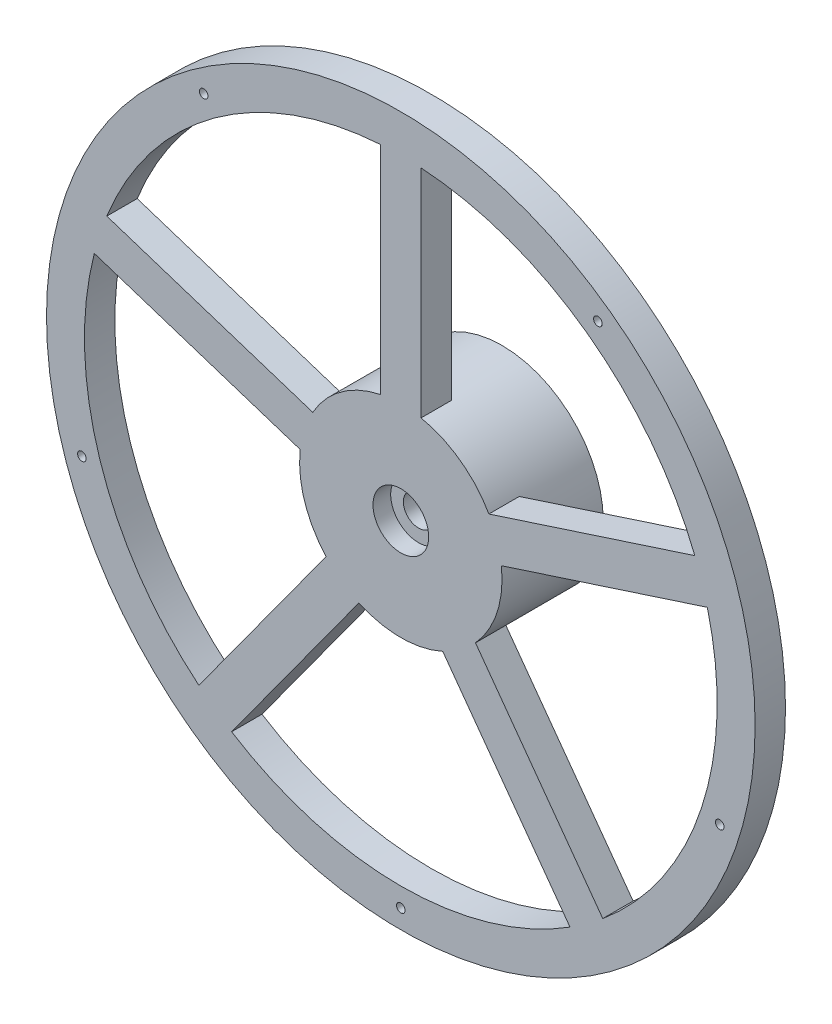
ISO-10303-21;
HEADER;
FILE_DESCRIPTION(('STEP AP214'),'2;1');
FILE_NAME('part.step','',(''),(''),'','','');
FILE_SCHEMA(('AUTOMOTIVE_DESIGN { 1 0 10303 214 1 1 1 1 }'));
ENDSEC;
DATA;
#1=APPLICATION_CONTEXT('core data for automotive mechanical design processes');
#2=APPLICATION_PROTOCOL_DEFINITION('international standard','automotive_design',2000,#1);
#3=PRODUCT_CONTEXT('',#1,'mechanical');
#4=PRODUCT('Part','Part','',(#3));
#5=PRODUCT_RELATED_PRODUCT_CATEGORY('part','',(#4));
#6=PRODUCT_DEFINITION_FORMATION('','',#4);
#7=PRODUCT_DEFINITION_CONTEXT('part definition',#1,'design');
#8=PRODUCT_DEFINITION('design','',#6,#7);
#9=PRODUCT_DEFINITION_SHAPE('','',#8);
#10=(LENGTH_UNIT() NAMED_UNIT(*) SI_UNIT(.MILLI.,.METRE.));
#11=(NAMED_UNIT(*) PLANE_ANGLE_UNIT() SI_UNIT($,.RADIAN.));
#12=(NAMED_UNIT(*) SI_UNIT($,.STERADIAN.) SOLID_ANGLE_UNIT());
#13=UNCERTAINTY_MEASURE_WITH_UNIT(LENGTH_MEASURE(1.E-05),#10,'distance_accuracy_value','');
#14=(GEOMETRIC_REPRESENTATION_CONTEXT(3) GLOBAL_UNCERTAINTY_ASSIGNED_CONTEXT((#13)) GLOBAL_UNIT_ASSIGNED_CONTEXT((#10,
#11,#12)) REPRESENTATION_CONTEXT('',''));
#15=CARTESIAN_POINT('',(0.,0.,0.));
#16=DIRECTION('',(0.,0.,1.));
#17=DIRECTION('',(1.,0.,0.));
#18=AXIS2_PLACEMENT_3D('',#15,#16,#17);
#19=CARTESIAN_POINT('',(0.,0.,40.));
#20=DIRECTION('',(0.,0.,-1.));
#21=DIRECTION('',(-1.,0.,0.));
#22=AXIS2_PLACEMENT_3D('',#19,#20,#21);
#23=CYLINDRICAL_SURFACE('',#22,6.);
#24=CARTESIAN_POINT('',(0.,0.,7.));
#25=DIRECTION('',(0.,0.,1.));
#26=DIRECTION('',(1.,0.,0.));
#27=AXIS2_PLACEMENT_3D('',#24,#25,#26);
#28=CIRCLE('',#27,6.);
#29=CARTESIAN_POINT('',(6.,0.,7.));
#30=VERTEX_POINT('',#29);
#31=EDGE_CURVE('E200',#30,#30,#28,.T.);
#32=ORIENTED_EDGE('',*,*,#31,.F.);
#33=EDGE_LOOP('',(#32));
#34=FACE_BOUND('',#33,.T.);
#35=CARTESIAN_POINT('',(0.,0.,33.));
#36=DIRECTION('',(0.,0.,1.));
#37=DIRECTION('',(1.,0.,0.));
#38=AXIS2_PLACEMENT_3D('',#35,#36,#37);
#39=CIRCLE('',#38,6.);
#40=CARTESIAN_POINT('',(6.,0.,33.));
#41=VERTEX_POINT('',#40);
#42=EDGE_CURVE('E43',#41,#41,#39,.T.);
#43=ORIENTED_EDGE('',*,*,#42,.T.);
#44=EDGE_LOOP('',(#43));
#45=FACE_BOUND('',#44,.T.);
#46=ADVANCED_FACE('F39',(#34,#45),#23,.F.);
#47=CARTESIAN_POINT('',(0.,0.,40.));
#48=DIRECTION('',(0.,0.,-1.));
#49=DIRECTION('',(-1.,0.,0.));
#50=AXIS2_PLACEMENT_3D('',#47,#48,#49);
#51=CYLINDRICAL_SURFACE('',#50,125.);
#52=CARTESIAN_POINT('',(0.,0.,40.));
#53=DIRECTION('',(0.,0.,1.));
#54=DIRECTION('',(1.,0.,0.));
#55=AXIS2_PLACEMENT_3D('',#52,#53,#54);
#56=CIRCLE('',#55,125.);
#57=CARTESIAN_POINT('',(-66.8503931562206,-105.622085450244,40.));
#58=VERTEX_POINT('',#57);
#59=CARTESIAN_POINT('',(66.8503931562205,-105.622085450244,40.));
#60=VERTEX_POINT('',#59);
#61=EDGE_CURVE('E862',#58,#60,#56,.T.);
#62=ORIENTED_EDGE('',*,*,#61,.T.);
#63=DIRECTION('',(0.,0.,-1.));
#64=VECTOR('',#63,1.);
#65=CARTESIAN_POINT('',(66.8503931562205,-105.622085450244,40.));
#66=LINE('',#65,#64);
#67=CARTESIAN_POINT('',(66.8503931562205,-105.622085450244,28.));
#68=VERTEX_POINT('',#67);
#69=EDGE_CURVE('E205',#60,#68,#66,.T.);
#70=ORIENTED_EDGE('',*,*,#69,.T.);
#71=CARTESIAN_POINT('',(0.,0.,28.));
#72=DIRECTION('',(0.,0.,1.));
#73=DIRECTION('',(1.,0.,0.));
#74=AXIS2_PLACEMENT_3D('',#71,#72,#73);
#75=CIRCLE('',#74,125.);
#76=CARTESIAN_POINT('',(-66.8503931562206,-105.622085450244,28.));
#77=VERTEX_POINT('',#76);
#78=EDGE_CURVE('E871',#77,#68,#75,.T.);
#79=ORIENTED_EDGE('',*,*,#78,.F.);
#80=DIRECTION('',(0.,0.,-1.));
#81=VECTOR('',#80,1.);
#82=CARTESIAN_POINT('',(-66.8503931562205,-105.622085450244,40.));
#83=LINE('',#82,#81);
#84=EDGE_CURVE('E222',#77,#58,#83,.F.);
#85=ORIENTED_EDGE('',*,*,#84,.T.);
#86=EDGE_LOOP('',(#62,#70,#79,#85));
#87=FACE_BOUND('',#86,.T.);
#88=ADVANCED_FACE('F421',(#87),#51,.F.);
#89=CARTESIAN_POINT('',(79.7946650662197,-96.2175214135649,28.));
#90=VERTEX_POINT('',#89);
#91=CARTESIAN_POINT('',(121.110480198057,30.9394826426681,28.));
#92=VERTEX_POINT('',#91);
#93=EDGE_CURVE('E290',#90,#92,#75,.T.);
#94=ORIENTED_EDGE('',*,*,#93,.F.);
#95=DIRECTION('',(0.,0.,-1.));
#96=VECTOR('',#95,1.);
#97=CARTESIAN_POINT('',(79.7946650662197,-96.2175214135649,40.));
#98=LINE('',#97,#96);
#99=CARTESIAN_POINT('',(79.7946650662197,-96.2175214135649,40.));
#100=VERTEX_POINT('',#99);
#101=EDGE_CURVE('E177',#90,#100,#98,.F.);
#102=ORIENTED_EDGE('',*,*,#101,.T.);
#103=CARTESIAN_POINT('',(121.110480198057,30.9394826426681,40.));
#104=VERTEX_POINT('',#103);
#105=EDGE_CURVE('E300',#100,#104,#56,.T.);
#106=ORIENTED_EDGE('',*,*,#105,.T.);
#107=DIRECTION('',(0.,0.,-1.));
#108=VECTOR('',#107,1.);
#109=CARTESIAN_POINT('',(121.110480198057,30.9394826426681,40.));
#110=LINE('',#109,#108);
#111=EDGE_CURVE('E313',#104,#92,#110,.T.);
#112=ORIENTED_EDGE('',*,*,#111,.T.);
#113=EDGE_LOOP('',(#94,#102,#106,#112));
#114=FACE_BOUND('',#113,.T.);
#115=ADVANCED_FACE('F429',(#114),#51,.F.);
#116=CARTESIAN_POINT('',(0.,0.,40.));
#117=DIRECTION('',(0.,0.,-1.));
#118=DIRECTION('',(-1.,0.,0.));
#119=AXIS2_PLACEMENT_3D('',#116,#117,#118);
#120=CYLINDRICAL_SURFACE('',#119,40.);
#121=CARTESIAN_POINT('',(0.,0.,0.));
#122=DIRECTION('',(0.,0.,1.));
#123=DIRECTION('',(1.,0.,0.));
#124=AXIS2_PLACEMENT_3D('',#121,#122,#123);
#125=CIRCLE('',#124,40.);
#126=CARTESIAN_POINT('',(40.,0.,0.));
#127=VERTEX_POINT('',#126);
#128=EDGE_CURVE('E271',#127,#127,#125,.T.);
#129=ORIENTED_EDGE('',*,*,#128,.T.);
#130=EDGE_LOOP('',(#129));
#131=FACE_BOUND('',#130,.T.);
#132=DIRECTION('',(0.,0.,-1.));
#133=VECTOR('',#132,1.);
#134=CARTESIAN_POINT('',(16.5642471881946,-36.4091432896792,40.));
#135=LINE('',#134,#133);
#136=CARTESIAN_POINT('',(16.5642471881946,-36.4091432896792,40.));
#137=VERTEX_POINT('',#136);
#138=CARTESIAN_POINT('',(16.5642471881946,-36.4091432896792,28.));
#139=VERTEX_POINT('',#138);
#140=EDGE_CURVE('E203',#137,#139,#135,.T.);
#141=ORIENTED_EDGE('',*,*,#140,.F.);
#142=CARTESIAN_POINT('',(0.,0.,40.));
#143=DIRECTION('',(0.,0.,1.));
#144=DIRECTION('',(1.,0.,0.));
#145=AXIS2_PLACEMENT_3D('',#142,#143,#144);
#146=CIRCLE('',#145,40.);
#147=CARTESIAN_POINT('',(-16.5642471881946,-36.4091432896792,40.));
#148=VERTEX_POINT('',#147);
#149=EDGE_CURVE('E863',#148,#137,#146,.T.);
#150=ORIENTED_EDGE('',*,*,#149,.F.);
#151=DIRECTION('',(0.,0.,-1.));
#152=VECTOR('',#151,1.);
#153=CARTESIAN_POINT('',(-16.5642471881946,-36.4091432896791,40.));
#154=LINE('',#153,#152);
#155=CARTESIAN_POINT('',(-16.5642471881946,-36.4091432896792,28.));
#156=VERTEX_POINT('',#155);
#157=EDGE_CURVE('E215',#156,#148,#154,.F.);
#158=ORIENTED_EDGE('',*,*,#157,.F.);
#159=CARTESIAN_POINT('',(0.,0.,28.));
#160=DIRECTION('',(0.,0.,1.));
#161=DIRECTION('',(1.,0.,0.));
#162=AXIS2_PLACEMENT_3D('',#159,#160,#161);
#163=CIRCLE('',#162,40.);
#164=CARTESIAN_POINT('',(-29.5085190981938,-27.0045792529996,28.));
#165=VERTEX_POINT('',#164);
#166=EDGE_CURVE('E48',#165,#156,#163,.T.);
#167=ORIENTED_EDGE('',*,*,#166,.F.);
#168=DIRECTION('',(0.,0.,-1.));
#169=VECTOR('',#168,1.);
#170=CARTESIAN_POINT('',(-29.5085190981938,-27.0045792529996,40.));
#171=LINE('',#170,#169);
#172=CARTESIAN_POINT('',(-29.5085190981938,-27.0045792529996,40.));
#173=VERTEX_POINT('',#172);
#174=EDGE_CURVE('E225',#173,#165,#171,.T.);
#175=ORIENTED_EDGE('',*,*,#174,.F.);
#176=CARTESIAN_POINT('',(-39.7457868585529,4.5024911987127,40.));
#177=VERTEX_POINT('',#176);
#178=EDGE_CURVE('E864',#177,#173,#146,.T.);
#179=ORIENTED_EDGE('',*,*,#178,.F.);
#180=DIRECTION('',(0.,0.,-1.));
#181=VECTOR('',#180,1.);
#182=CARTESIAN_POINT('',(-39.7457868585529,4.50249119871271,40.));
#183=LINE('',#182,#181);
#184=CARTESIAN_POINT('',(-39.7457868585529,4.50249119871271,28.));
#185=VERTEX_POINT('',#184);
#186=EDGE_CURVE('E238',#185,#177,#183,.F.);
#187=ORIENTED_EDGE('',*,*,#186,.F.);
#188=CARTESIAN_POINT('',(0.,0.,28.));
#189=DIRECTION('',(0.,0.,1.));
#190=DIRECTION('',(1.,0.,0.));
#191=AXIS2_PLACEMENT_3D('',#188,#189,#190);
#192=CIRCLE('',#191,40.);
#193=CARTESIAN_POINT('',(-34.8015149485537,19.7193954594352,28.));
#194=VERTEX_POINT('',#193);
#195=EDGE_CURVE('E327',#194,#185,#192,.T.);
#196=ORIENTED_EDGE('',*,*,#195,.F.);
#197=DIRECTION('',(0.,0.,-1.));
#198=VECTOR('',#197,1.);
#199=CARTESIAN_POINT('',(-34.8015149485537,19.7193954594352,40.));
#200=LINE('',#199,#198);
#201=CARTESIAN_POINT('',(-34.8015149485537,19.7193954594352,40.));
#202=VERTEX_POINT('',#201);
#203=EDGE_CURVE('E248',#202,#194,#200,.T.);
#204=ORIENTED_EDGE('',*,*,#203,.F.);
#205=CARTESIAN_POINT('',(-8.,39.1918358845309,40.));
#206=VERTEX_POINT('',#205);
#207=EDGE_CURVE('E276',#206,#202,#146,.T.);
#208=ORIENTED_EDGE('',*,*,#207,.F.);
#209=DIRECTION('',(0.,0.,-1.));
#210=VECTOR('',#209,1.);
#211=CARTESIAN_POINT('',(-8.,39.1918358845309,40.));
#212=LINE('',#211,#210);
#213=CARTESIAN_POINT('',(-8.,39.1918358845309,28.));
#214=VERTEX_POINT('',#213);
#215=EDGE_CURVE('E321',#214,#206,#212,.F.);
#216=ORIENTED_EDGE('',*,*,#215,.F.);
#217=CARTESIAN_POINT('',(0.,0.,28.));
#218=DIRECTION('',(0.,0.,1.));
#219=DIRECTION('',(1.,0.,0.));
#220=AXIS2_PLACEMENT_3D('',#217,#218,#219);
#221=CIRCLE('',#220,40.);
#222=CARTESIAN_POINT('',(8.,39.1918358845309,28.));
#223=VERTEX_POINT('',#222);
#224=EDGE_CURVE('E318',#223,#214,#221,.T.);
#225=ORIENTED_EDGE('',*,*,#224,.F.);
#226=DIRECTION('',(0.,0.,-1.));
#227=VECTOR('',#226,1.);
#228=CARTESIAN_POINT('',(8.,39.1918358845309,40.));
#229=LINE('',#228,#227);
#230=CARTESIAN_POINT('',(8.,39.1918358845309,40.));
#231=VERTEX_POINT('',#230);
#232=EDGE_CURVE('E324',#231,#223,#229,.T.);
#233=ORIENTED_EDGE('',*,*,#232,.F.);
#234=CARTESIAN_POINT('',(34.8015149485537,19.7193954594352,40.));
#235=VERTEX_POINT('',#234);
#236=EDGE_CURVE('E272',#235,#231,#146,.T.);
#237=ORIENTED_EDGE('',*,*,#236,.F.);
#238=DIRECTION('',(0.,0.,-1.));
#239=VECTOR('',#238,1.);
#240=CARTESIAN_POINT('',(34.8015149485537,19.7193954594352,40.));
#241=LINE('',#240,#239);
#242=CARTESIAN_POINT('',(34.8015149485537,19.7193954594352,28.));
#243=VERTEX_POINT('',#242);
#244=EDGE_CURVE('E316',#235,#243,#241,.T.);
#245=ORIENTED_EDGE('',*,*,#244,.T.);
#246=CARTESIAN_POINT('',(0.,0.,28.));
#247=DIRECTION('',(0.,0.,1.));
#248=DIRECTION('',(1.,0.,0.));
#249=AXIS2_PLACEMENT_3D('',#246,#247,#248);
#250=CIRCLE('',#249,40.);
#251=CARTESIAN_POINT('',(39.7457868585529,4.5024911987127,28.));
#252=VERTEX_POINT('',#251);
#253=EDGE_CURVE('E275',#243,#252,#250,.F.);
#254=ORIENTED_EDGE('',*,*,#253,.T.);
#255=DIRECTION('',(0.,0.,-1.));
#256=VECTOR('',#255,1.);
#257=CARTESIAN_POINT('',(39.7457868585529,4.5024911987127,40.));
#258=LINE('',#257,#256);
#259=CARTESIAN_POINT('',(39.7457868585529,4.5024911987127,40.));
#260=VERTEX_POINT('',#259);
#261=EDGE_CURVE('E280',#252,#260,#258,.F.);
#262=ORIENTED_EDGE('',*,*,#261,.T.);
#263=CARTESIAN_POINT('',(29.5085190981937,-27.0045792529996,40.));
#264=VERTEX_POINT('',#263);
#265=EDGE_CURVE('E60',#264,#260,#146,.T.);
#266=ORIENTED_EDGE('',*,*,#265,.F.);
#267=DIRECTION('',(0.,0.,-1.));
#268=VECTOR('',#267,1.);
#269=CARTESIAN_POINT('',(29.5085190981937,-27.0045792529996,40.));
#270=LINE('',#269,#268);
#271=CARTESIAN_POINT('',(29.5085190981937,-27.0045792529996,28.));
#272=VERTEX_POINT('',#271);
#273=EDGE_CURVE('E172',#272,#264,#270,.F.);
#274=ORIENTED_EDGE('',*,*,#273,.F.);
#275=CARTESIAN_POINT('',(0.,0.,28.));
#276=DIRECTION('',(0.,0.,1.));
#277=DIRECTION('',(1.,0.,0.));
#278=AXIS2_PLACEMENT_3D('',#275,#276,#277);
#279=CIRCLE('',#278,40.);
#280=EDGE_CURVE('E11',#139,#272,#279,.T.);
#281=ORIENTED_EDGE('',*,*,#280,.F.);
#282=EDGE_LOOP('',(#141,#150,#158,#167,#175,#179,#187,#196,#204,#208,#216,#225,#233,#237,#245,
#254,#262,#266,#274,#281));
#283=FACE_BOUND('',#282,.T.);
#284=ADVANCED_FACE('F173',(#131,#283),#120,.T.);
#285=CARTESIAN_POINT('',(-121.110480198057,30.9394826426681,40.));
#286=VERTEX_POINT('',#285);
#287=CARTESIAN_POINT('',(-79.7946650662197,-96.2175214135649,40.));
#288=VERTEX_POINT('',#287);
#289=EDGE_CURVE('E876',#286,#288,#56,.T.);
#290=ORIENTED_EDGE('',*,*,#289,.T.);
#291=DIRECTION('',(0.,0.,-1.));
#292=VECTOR('',#291,1.);
#293=CARTESIAN_POINT('',(-79.7946650662197,-96.2175214135649,40.));
#294=LINE('',#293,#292);
#295=CARTESIAN_POINT('',(-79.7946650662197,-96.2175214135649,28.));
#296=VERTEX_POINT('',#295);
#297=EDGE_CURVE('E228',#288,#296,#294,.T.);
#298=ORIENTED_EDGE('',*,*,#297,.T.);
#299=CARTESIAN_POINT('',(-121.110480198057,30.9394826426681,28.));
#300=VERTEX_POINT('',#299);
#301=EDGE_CURVE('E869',#300,#296,#75,.T.);
#302=ORIENTED_EDGE('',*,*,#301,.F.);
#303=DIRECTION('',(0.,0.,-1.));
#304=VECTOR('',#303,1.);
#305=CARTESIAN_POINT('',(-121.110480198057,30.9394826426681,40.));
#306=LINE('',#305,#304);
#307=EDGE_CURVE('E245',#300,#286,#306,.F.);
#308=ORIENTED_EDGE('',*,*,#307,.T.);
#309=EDGE_LOOP('',(#290,#298,#302,#308));
#310=FACE_BOUND('',#309,.T.);
#311=ADVANCED_FACE('F473',(#310),#51,.F.);
#312=CARTESIAN_POINT('',(-7.99999999999999,124.743737317751,40.));
#313=VERTEX_POINT('',#312);
#314=CARTESIAN_POINT('',(-116.166208288058,46.1563869033905,40.));
#315=VERTEX_POINT('',#314);
#316=EDGE_CURVE('E299',#313,#315,#56,.T.);
#317=ORIENTED_EDGE('',*,*,#316,.T.);
#318=DIRECTION('',(0.,0.,-1.));
#319=VECTOR('',#318,1.);
#320=CARTESIAN_POINT('',(-116.166208288058,46.1563869033905,40.));
#321=LINE('',#320,#319);
#322=CARTESIAN_POINT('',(-116.166208288058,46.1563869033905,28.));
#323=VERTEX_POINT('',#322);
#324=EDGE_CURVE('E251',#315,#323,#321,.T.);
#325=ORIENTED_EDGE('',*,*,#324,.T.);
#326=CARTESIAN_POINT('',(-7.99999999999999,124.743737317751,28.));
#327=VERTEX_POINT('',#326);
#328=EDGE_CURVE('E304',#327,#323,#75,.T.);
#329=ORIENTED_EDGE('',*,*,#328,.F.);
#330=DIRECTION('',(0.,0.,-1.));
#331=VECTOR('',#330,1.);
#332=CARTESIAN_POINT('',(-7.99999999999999,124.743737317751,40.));
#333=LINE('',#332,#331);
#334=EDGE_CURVE('E261',#327,#313,#333,.F.);
#335=ORIENTED_EDGE('',*,*,#334,.T.);
#336=EDGE_LOOP('',(#317,#325,#329,#335));
#337=FACE_BOUND('',#336,.T.);
#338=ADVANCED_FACE('F485',(#337),#51,.F.);
#339=CARTESIAN_POINT('',(116.166208288058,46.1563869033905,40.));
#340=VERTEX_POINT('',#339);
#341=CARTESIAN_POINT('',(8.00000000000001,124.743737317751,40.));
#342=VERTEX_POINT('',#341);
#343=EDGE_CURVE('E295',#340,#342,#56,.T.);
#344=ORIENTED_EDGE('',*,*,#343,.T.);
#345=DIRECTION('',(0.,0.,-1.));
#346=VECTOR('',#345,1.);
#347=CARTESIAN_POINT('',(8.00000000000001,124.743737317751,40.));
#348=LINE('',#347,#346);
#349=CARTESIAN_POINT('',(8.00000000000001,124.743737317751,28.));
#350=VERTEX_POINT('',#349);
#351=EDGE_CURVE('E268',#342,#350,#348,.T.);
#352=ORIENTED_EDGE('',*,*,#351,.T.);
#353=CARTESIAN_POINT('',(116.166208288058,46.1563869033905,28.));
#354=VERTEX_POINT('',#353);
#355=EDGE_CURVE('E301',#354,#350,#75,.T.);
#356=ORIENTED_EDGE('',*,*,#355,.F.);
#357=DIRECTION('',(0.,0.,-1.));
#358=VECTOR('',#357,1.);
#359=CARTESIAN_POINT('',(116.166208288058,46.1563869033905,40.));
#360=LINE('',#359,#358);
#361=EDGE_CURVE('E308',#354,#340,#360,.F.);
#362=ORIENTED_EDGE('',*,*,#361,.T.);
#363=EDGE_LOOP('',(#344,#352,#356,#362));
#364=FACE_BOUND('',#363,.T.);
#365=ADVANCED_FACE('F432',(#364),#51,.F.);
#366=CARTESIAN_POINT('',(39.5633400905106,4.44321065026172,40.));
#367=DIRECTION('',(-0.309016994374947,0.951056516295153,0.));
#368=DIRECTION('',(-0.951056516295154,-0.309016994374948,0.));
#369=AXIS2_PLACEMENT_3D('',#366,#367,#368);
#370=PLANE('',#369);
#371=ORIENTED_EDGE('',*,*,#261,.F.);
#372=DIRECTION('',(0.951056516295154,0.309016994374948,0.));
#373=VECTOR('',#372,1.);
#374=CARTESIAN_POINT('',(39.5633400905106,4.44321065026172,28.));
#375=LINE('',#374,#373);
#376=EDGE_CURVE('E282',#252,#92,#375,.T.);
#377=ORIENTED_EDGE('',*,*,#376,.T.);
#378=ORIENTED_EDGE('',*,*,#111,.F.);
#379=DIRECTION('',(0.951056516295154,0.309016994374948,0.));
#380=VECTOR('',#379,1.);
#381=CARTESIAN_POINT('',(39.5633400905106,4.44321065026172,40.));
#382=LINE('',#381,#380);
#383=EDGE_CURVE('E283',#260,#104,#382,.T.);
#384=ORIENTED_EDGE('',*,*,#383,.F.);
#385=EDGE_LOOP('',(#371,#377,#378,#384));
#386=FACE_BOUND('',#385,.T.);
#387=ADVANCED_FACE('F479',(#386),#370,.F.);
#388=CARTESIAN_POINT('',(117.36098509819,46.5445934216046,40.));
#389=DIRECTION('',(0.309016994374947,-0.951056516295154,0.));
#390=DIRECTION('',(0.951056516295154,0.309016994374947,0.));
#391=AXIS2_PLACEMENT_3D('',#388,#389,#390);
#392=PLANE('',#391);
#393=ORIENTED_EDGE('',*,*,#244,.F.);
#394=DIRECTION('',(-0.951056516295154,-0.309016994374947,0.));
#395=VECTOR('',#394,1.);
#396=CARTESIAN_POINT('',(117.36098509819,46.5445934216046,40.));
#397=LINE('',#396,#395);
#398=EDGE_CURVE('E286',#340,#235,#397,.T.);
#399=ORIENTED_EDGE('',*,*,#398,.F.);
#400=ORIENTED_EDGE('',*,*,#361,.F.);
#401=DIRECTION('',(-0.951056516295154,-0.309016994374947,0.));
#402=VECTOR('',#401,1.);
#403=CARTESIAN_POINT('',(117.36098509819,46.5445934216046,28.));
#404=LINE('',#403,#402);
#405=EDGE_CURVE('E287',#354,#243,#404,.T.);
#406=ORIENTED_EDGE('',*,*,#405,.T.);
#407=EDGE_LOOP('',(#393,#399,#400,#406));
#408=FACE_BOUND('',#407,.T.);
#409=ADVANCED_FACE('F475',(#408),#392,.F.);
#410=CARTESIAN_POINT('',(0.,0.,40.));
#411=DIRECTION('',(0.,0.,1.));
#412=DIRECTION('',(1.,0.,0.));
#413=AXIS2_PLACEMENT_3D('',#410,#411,#412);
#414=PLANE('',#413);
#415=CARTESIAN_POINT('',(126.014988409108,-40.9447517546806,40.));
#416=DIRECTION('',(0.,0.,1.));
#417=DIRECTION('',(1.,0.,0.));
#418=AXIS2_PLACEMENT_3D('',#415,#416,#417);
#419=CIRCLE('',#418,1.70000000000001);
#420=CARTESIAN_POINT('',(127.714988409108,-40.9447517546806,40.));
#421=VERTEX_POINT('',#420);
#422=EDGE_CURVE('E353',#421,#421,#419,.T.);
#423=ORIENTED_EDGE('',*,*,#422,.F.);
#424=EDGE_LOOP('',(#423));
#425=FACE_BOUND('',#424,.T.);
#426=CARTESIAN_POINT('',(0.,-132.5,40.));
#427=DIRECTION('',(0.,0.,1.));
#428=DIRECTION('',(1.,0.,0.));
#429=AXIS2_PLACEMENT_3D('',#426,#427,#428);
#430=CIRCLE('',#429,1.7);
#431=CARTESIAN_POINT('',(1.69999999999998,-132.5,40.));
#432=VERTEX_POINT('',#431);
#433=EDGE_CURVE('E360',#432,#432,#430,.T.);
#434=ORIENTED_EDGE('',*,*,#433,.F.);
#435=EDGE_LOOP('',(#434));
#436=FACE_BOUND('',#435,.T.);
#437=CARTESIAN_POINT('',(-126.014988409108,-40.9447517546805,40.));
#438=DIRECTION('',(0.,0.,1.));
#439=DIRECTION('',(1.,0.,0.));
#440=AXIS2_PLACEMENT_3D('',#437,#438,#439);
#441=CIRCLE('',#440,1.69999999999999);
#442=CARTESIAN_POINT('',(-124.314988409108,-40.9447517546805,40.));
#443=VERTEX_POINT('',#442);
#444=EDGE_CURVE('E366',#443,#443,#441,.T.);
#445=ORIENTED_EDGE('',*,*,#444,.F.);
#446=EDGE_LOOP('',(#445));
#447=FACE_BOUND('',#446,.T.);
#448=CARTESIAN_POINT('',(-77.8815459287527,107.194751754681,40.));
#449=DIRECTION('',(0.,0.,1.));
#450=DIRECTION('',(1.,0.,0.));
#451=AXIS2_PLACEMENT_3D('',#448,#449,#450);
#452=CIRCLE('',#451,1.69999999999999);
#453=CARTESIAN_POINT('',(-76.1815459287527,107.194751754681,40.));
#454=VERTEX_POINT('',#453);
#455=EDGE_CURVE('E372',#454,#454,#452,.T.);
#456=ORIENTED_EDGE('',*,*,#455,.F.);
#457=EDGE_LOOP('',(#456));
#458=FACE_BOUND('',#457,.T.);
#459=CARTESIAN_POINT('',(77.8815459287527,107.194751754681,40.));
#460=DIRECTION('',(0.,0.,1.));
#461=DIRECTION('',(1.,0.,0.));
#462=AXIS2_PLACEMENT_3D('',#459,#460,#461);
#463=CIRCLE('',#462,1.69999999999999);
#464=CARTESIAN_POINT('',(79.5815459287527,107.194751754681,40.));
#465=VERTEX_POINT('',#464);
#466=EDGE_CURVE('E344',#465,#465,#463,.T.);
#467=ORIENTED_EDGE('',*,*,#466,.F.);
#468=EDGE_LOOP('',(#467));
#469=FACE_BOUND('',#468,.T.);
#470=CARTESIAN_POINT('',(0.,0.,40.));
#471=DIRECTION('',(0.,0.,1.));
#472=DIRECTION('',(1.,0.,0.));
#473=AXIS2_PLACEMENT_3D('',#470,#471,#472);
#474=CIRCLE('',#473,11.);
#475=CARTESIAN_POINT('',(11.,0.,40.));
#476=VERTEX_POINT('',#475);
#477=EDGE_CURVE('E343',#476,#476,#474,.T.);
#478=ORIENTED_EDGE('',*,*,#477,.F.);
#479=EDGE_LOOP('',(#478));
#480=FACE_BOUND('',#479,.T.);
#481=ORIENTED_EDGE('',*,*,#105,.F.);
#482=DIRECTION('',(-0.587785252292473,0.809016994374947,0.));
#483=VECTOR('',#482,1.);
#484=CARTESIAN_POINT('',(80.5330777438512,-97.2338592729036,40.));
#485=LINE('',#484,#483);
#486=EDGE_CURVE('E194',#100,#264,#485,.T.);
#487=ORIENTED_EDGE('',*,*,#486,.T.);
#488=ORIENTED_EDGE('',*,*,#265,.T.);
#489=ORIENTED_EDGE('',*,*,#383,.T.);
#490=EDGE_LOOP('',(#481,#487,#488,#489));
#491=FACE_BOUND('',#490,.T.);
#492=DIRECTION('',(0.587785252292473,-0.809016994374948,0.));
#493=VECTOR('',#492,1.);
#494=CARTESIAN_POINT('',(16.4514888844069,-36.2539447989627,40.));
#495=LINE('',#494,#493);
#496=EDGE_CURVE('E190',#137,#60,#495,.T.);
#497=ORIENTED_EDGE('',*,*,#496,.T.);
#498=ORIENTED_EDGE('',*,*,#61,.F.);
#499=DIRECTION('',(0.587785252292473,0.809016994374947,0.));
#500=VECTOR('',#499,1.);
#501=CARTESIAN_POINT('',(-67.5888058338521,-106.638423309583,40.));
#502=LINE('',#501,#500);
#503=EDGE_CURVE('E208',#58,#148,#502,.T.);
#504=ORIENTED_EDGE('',*,*,#503,.T.);
#505=ORIENTED_EDGE('',*,*,#149,.T.);
#506=EDGE_LOOP('',(#497,#498,#504,#505));
#507=FACE_BOUND('',#506,.T.);
#508=DIRECTION('',(-0.587785252292473,-0.809016994374947,0.));
#509=VECTOR('',#508,1.);
#510=CARTESIAN_POINT('',(-29.395760794406,-26.8493807622832,40.));
#511=LINE('',#510,#509);
#512=EDGE_CURVE('E213',#173,#288,#511,.T.);
#513=ORIENTED_EDGE('',*,*,#512,.T.);
#514=ORIENTED_EDGE('',*,*,#289,.F.);
#515=DIRECTION('',(0.951056516295154,-0.309016994374947,0.));
#516=VECTOR('',#515,1.);
#517=CARTESIAN_POINT('',(-122.305257008189,31.3276891608822,40.));
#518=LINE('',#517,#516);
#519=EDGE_CURVE('E231',#286,#177,#518,.T.);
#520=ORIENTED_EDGE('',*,*,#519,.T.);
#521=ORIENTED_EDGE('',*,*,#178,.T.);
#522=EDGE_LOOP('',(#513,#514,#520,#521));
#523=FACE_BOUND('',#522,.T.);
#524=DIRECTION('',(-0.951056516295154,0.309016994374948,0.));
#525=VECTOR('',#524,1.);
#526=CARTESIAN_POINT('',(-34.6190681805114,19.6601149109842,40.));
#527=LINE('',#526,#525);
#528=EDGE_CURVE('E236',#202,#315,#527,.T.);
#529=ORIENTED_EDGE('',*,*,#528,.T.);
#530=ORIENTED_EDGE('',*,*,#316,.F.);
#531=DIRECTION('',(0.,-1.,0.));
#532=VECTOR('',#531,1.);
#533=CARTESIAN_POINT('',(-7.99999999999999,126.,40.));
#534=LINE('',#533,#532);
#535=EDGE_CURVE('E254',#313,#206,#534,.T.);
#536=ORIENTED_EDGE('',*,*,#535,.T.);
#537=ORIENTED_EDGE('',*,*,#207,.T.);
#538=EDGE_LOOP('',(#529,#530,#536,#537));
#539=FACE_BOUND('',#538,.T.);
#540=DIRECTION('',(0.,1.,0.));
#541=VECTOR('',#540,1.);
#542=CARTESIAN_POINT('',(8.,39.,40.));
#543=LINE('',#542,#541);
#544=EDGE_CURVE('E259',#231,#342,#543,.T.);
#545=ORIENTED_EDGE('',*,*,#544,.T.);
#546=ORIENTED_EDGE('',*,*,#343,.F.);
#547=ORIENTED_EDGE('',*,*,#398,.T.);
#548=ORIENTED_EDGE('',*,*,#236,.T.);
#549=EDGE_LOOP('',(#545,#546,#547,#548));
#550=FACE_BOUND('',#549,.T.);
#551=CARTESIAN_POINT('',(0.,0.,40.));
#552=DIRECTION('',(0.,0.,1.));
#553=DIRECTION('',(1.,0.,0.));
#554=AXIS2_PLACEMENT_3D('',#551,#552,#553);
#555=CIRCLE('',#554,140.);
#556=CARTESIAN_POINT('',(140.,0.,40.));
#557=VERTEX_POINT('',#556);
#558=EDGE_CURVE('E305',#557,#557,#555,.T.);
#559=ORIENTED_EDGE('',*,*,#558,.T.);
#560=EDGE_LOOP('',(#559));
#561=FACE_BOUND('',#560,.T.);
#562=ADVANCED_FACE('F478',(#425,#436,#447,#458,#469,#480,#491,#507,#523,#539,#550,#561),#414,.T.);
#563=CARTESIAN_POINT('',(0.,0.,28.));
#564=DIRECTION('',(0.,0.,1.));
#565=DIRECTION('',(1.,0.,0.));
#566=AXIS2_PLACEMENT_3D('',#563,#564,#565);
#567=PLANE('',#566);
#568=CARTESIAN_POINT('',(126.014988409108,-40.9447517546806,28.));
#569=DIRECTION('',(0.,0.,1.));
#570=DIRECTION('',(1.,0.,0.));
#571=AXIS2_PLACEMENT_3D('',#568,#569,#570);
#572=CIRCLE('',#571,1.70000000000001);
#573=CARTESIAN_POINT('',(127.714988409108,-40.9447517546806,28.));
#574=VERTEX_POINT('',#573);
#575=EDGE_CURVE('E356',#574,#574,#572,.T.);
#576=ORIENTED_EDGE('',*,*,#575,.T.);
#577=EDGE_LOOP('',(#576));
#578=FACE_BOUND('',#577,.T.);
#579=CARTESIAN_POINT('',(0.,-132.5,28.));
#580=DIRECTION('',(0.,0.,1.));
#581=DIRECTION('',(1.,0.,0.));
#582=AXIS2_PLACEMENT_3D('',#579,#580,#581);
#583=CIRCLE('',#582,1.7);
#584=CARTESIAN_POINT('',(1.69999999999998,-132.5,28.));
#585=VERTEX_POINT('',#584);
#586=EDGE_CURVE('E363',#585,#585,#583,.T.);
#587=ORIENTED_EDGE('',*,*,#586,.T.);
#588=EDGE_LOOP('',(#587));
#589=FACE_BOUND('',#588,.T.);
#590=CARTESIAN_POINT('',(-126.014988409108,-40.9447517546805,28.));
#591=DIRECTION('',(0.,0.,1.));
#592=DIRECTION('',(1.,0.,0.));
#593=AXIS2_PLACEMENT_3D('',#590,#591,#592);
#594=CIRCLE('',#593,1.69999999999999);
#595=CARTESIAN_POINT('',(-124.314988409108,-40.9447517546805,28.));
#596=VERTEX_POINT('',#595);
#597=EDGE_CURVE('E369',#596,#596,#594,.T.);
#598=ORIENTED_EDGE('',*,*,#597,.T.);
#599=EDGE_LOOP('',(#598));
#600=FACE_BOUND('',#599,.T.);
#601=CARTESIAN_POINT('',(-77.8815459287527,107.194751754681,28.));
#602=DIRECTION('',(0.,0.,1.));
#603=DIRECTION('',(1.,0.,0.));
#604=AXIS2_PLACEMENT_3D('',#601,#602,#603);
#605=CIRCLE('',#604,1.69999999999999);
#606=CARTESIAN_POINT('',(-76.1815459287527,107.194751754681,28.));
#607=VERTEX_POINT('',#606);
#608=EDGE_CURVE('E350',#607,#607,#605,.T.);
#609=ORIENTED_EDGE('',*,*,#608,.T.);
#610=EDGE_LOOP('',(#609));
#611=FACE_BOUND('',#610,.T.);
#612=CARTESIAN_POINT('',(77.8815459287527,107.194751754681,28.));
#613=DIRECTION('',(0.,0.,1.));
#614=DIRECTION('',(1.,0.,0.));
#615=AXIS2_PLACEMENT_3D('',#612,#613,#614);
#616=CIRCLE('',#615,1.69999999999999);
#617=CARTESIAN_POINT('',(79.5815459287527,107.194751754681,28.));
#618=VERTEX_POINT('',#617);
#619=EDGE_CURVE('E347',#618,#618,#616,.T.);
#620=ORIENTED_EDGE('',*,*,#619,.T.);
#621=EDGE_LOOP('',(#620));
#622=FACE_BOUND('',#621,.T.);
#623=ORIENTED_EDGE('',*,*,#78,.T.);
#624=DIRECTION('',(0.587785252292473,-0.809016994374948,0.));
#625=VECTOR('',#624,1.);
#626=CARTESIAN_POINT('',(16.4514888844069,-36.2539447989627,28.));
#627=LINE('',#626,#625);
#628=EDGE_CURVE('E178',#139,#68,#627,.T.);
#629=ORIENTED_EDGE('',*,*,#628,.F.);
#630=ORIENTED_EDGE('',*,*,#280,.T.);
#631=DIRECTION('',(-0.587785252292473,0.809016994374947,0.));
#632=VECTOR('',#631,1.);
#633=CARTESIAN_POINT('',(80.5330777438512,-97.2338592729036,28.));
#634=LINE('',#633,#632);
#635=EDGE_CURVE('E185',#90,#272,#634,.T.);
#636=ORIENTED_EDGE('',*,*,#635,.F.);
#637=ORIENTED_EDGE('',*,*,#93,.T.);
#638=ORIENTED_EDGE('',*,*,#376,.F.);
#639=ORIENTED_EDGE('',*,*,#253,.F.);
#640=ORIENTED_EDGE('',*,*,#405,.F.);
#641=ORIENTED_EDGE('',*,*,#355,.T.);
#642=DIRECTION('',(0.,1.,0.));
#643=VECTOR('',#642,1.);
#644=CARTESIAN_POINT('',(8.,39.,28.));
#645=LINE('',#644,#643);
#646=EDGE_CURVE('E258',#223,#350,#645,.T.);
#647=ORIENTED_EDGE('',*,*,#646,.F.);
#648=ORIENTED_EDGE('',*,*,#224,.T.);
#649=DIRECTION('',(0.,-1.,0.));
#650=VECTOR('',#649,1.);
#651=CARTESIAN_POINT('',(-7.99999999999999,126.,28.));
#652=LINE('',#651,#650);
#653=EDGE_CURVE('E255',#327,#214,#652,.T.);
#654=ORIENTED_EDGE('',*,*,#653,.F.);
#655=ORIENTED_EDGE('',*,*,#328,.T.);
#656=DIRECTION('',(-0.951056516295154,0.309016994374948,0.));
#657=VECTOR('',#656,1.);
#658=CARTESIAN_POINT('',(-34.6190681805114,19.6601149109842,28.));
#659=LINE('',#658,#657);
#660=EDGE_CURVE('E235',#194,#323,#659,.T.);
#661=ORIENTED_EDGE('',*,*,#660,.F.);
#662=ORIENTED_EDGE('',*,*,#195,.T.);
#663=DIRECTION('',(0.951056516295154,-0.309016994374947,0.));
#664=VECTOR('',#663,1.);
#665=CARTESIAN_POINT('',(-122.305257008189,31.3276891608822,28.));
#666=LINE('',#665,#664);
#667=EDGE_CURVE('E232',#300,#185,#666,.T.);
#668=ORIENTED_EDGE('',*,*,#667,.F.);
#669=ORIENTED_EDGE('',*,*,#301,.T.);
#670=DIRECTION('',(-0.587785252292473,-0.809016994374947,0.));
#671=VECTOR('',#670,1.);
#672=CARTESIAN_POINT('',(-29.395760794406,-26.8493807622832,28.));
#673=LINE('',#672,#671);
#674=EDGE_CURVE('E212',#165,#296,#673,.T.);
#675=ORIENTED_EDGE('',*,*,#674,.F.);
#676=ORIENTED_EDGE('',*,*,#166,.T.);
#677=DIRECTION('',(0.587785252292473,0.809016994374947,0.));
#678=VECTOR('',#677,1.);
#679=CARTESIAN_POINT('',(-67.5888058338521,-106.638423309583,28.));
#680=LINE('',#679,#678);
#681=EDGE_CURVE('E209',#77,#156,#680,.T.);
#682=ORIENTED_EDGE('',*,*,#681,.F.);
#683=EDGE_LOOP('',(#623,#629,#630,#636,#637,#638,#639,#640,#641,#647,#648,#654,#655,#661,#662,
#668,#669,#675,#676,#682));
#684=FACE_BOUND('',#683,.T.);
#685=CARTESIAN_POINT('',(0.,0.,28.));
#686=DIRECTION('',(0.,0.,1.));
#687=DIRECTION('',(1.,0.,0.));
#688=AXIS2_PLACEMENT_3D('',#685,#686,#687);
#689=CIRCLE('',#688,140.);
#690=CARTESIAN_POINT('',(140.,0.,28.));
#691=VERTEX_POINT('',#690);
#692=EDGE_CURVE('E298',#691,#691,#689,.T.);
#693=ORIENTED_EDGE('',*,*,#692,.F.);
#694=EDGE_LOOP('',(#693));
#695=FACE_BOUND('',#694,.T.);
#696=ADVANCED_FACE('F183',(#578,#589,#600,#611,#622,#684,#695),#567,.F.);
#697=CARTESIAN_POINT('',(0.,0.,40.));
#698=DIRECTION('',(0.,0.,-1.));
#699=DIRECTION('',(-1.,0.,0.));
#700=AXIS2_PLACEMENT_3D('',#697,#698,#699);
#701=CYLINDRICAL_SURFACE('',#700,140.);
#702=ORIENTED_EDGE('',*,*,#558,.F.);
#703=EDGE_LOOP('',(#702));
#704=FACE_BOUND('',#703,.T.);
#705=ORIENTED_EDGE('',*,*,#692,.T.);
#706=EDGE_LOOP('',(#705));
#707=FACE_BOUND('',#706,.T.);
#708=ADVANCED_FACE('F41',(#704,#707),#701,.T.);
#709=CARTESIAN_POINT('',(0.,0.,0.));
#710=DIRECTION('',(0.,0.,1.));
#711=DIRECTION('',(1.,0.,0.));
#712=AXIS2_PLACEMENT_3D('',#709,#710,#711);
#713=PLANE('',#712);
#714=CARTESIAN_POINT('',(21.2132034355964,-21.2132034355964,0.));
#715=DIRECTION('',(0.,0.,1.));
#716=DIRECTION('',(1.,0.,0.));
#717=AXIS2_PLACEMENT_3D('',#714,#715,#716);
#718=CIRCLE('',#717,1.25);
#719=CARTESIAN_POINT('',(22.4632034355964,-21.2132034355964,0.));
#720=VERTEX_POINT('',#719);
#721=EDGE_CURVE('E386',#720,#720,#718,.T.);
#722=ORIENTED_EDGE('',*,*,#721,.T.);
#723=EDGE_LOOP('',(#722));
#724=FACE_BOUND('',#723,.T.);
#725=CARTESIAN_POINT('',(-21.2132034355964,-21.2132034355964,0.));
#726=DIRECTION('',(0.,0.,1.));
#727=DIRECTION('',(1.,0.,0.));
#728=AXIS2_PLACEMENT_3D('',#725,#726,#727);
#729=CIRCLE('',#728,1.25);
#730=CARTESIAN_POINT('',(-19.9632034355964,-21.2132034355964,0.));
#731=VERTEX_POINT('',#730);
#732=EDGE_CURVE('E392',#731,#731,#729,.T.);
#733=ORIENTED_EDGE('',*,*,#732,.T.);
#734=EDGE_LOOP('',(#733));
#735=FACE_BOUND('',#734,.T.);
#736=CARTESIAN_POINT('',(-21.2132034355964,21.2132034355964,0.));
#737=DIRECTION('',(0.,0.,1.));
#738=DIRECTION('',(1.,0.,0.));
#739=AXIS2_PLACEMENT_3D('',#736,#737,#738);
#740=CIRCLE('',#739,1.25);
#741=CARTESIAN_POINT('',(-19.9632034355964,21.2132034355964,0.));
#742=VERTEX_POINT('',#741);
#743=EDGE_CURVE('E380',#742,#742,#740,.T.);
#744=ORIENTED_EDGE('',*,*,#743,.T.);
#745=EDGE_LOOP('',(#744));
#746=FACE_BOUND('',#745,.T.);
#747=CARTESIAN_POINT('',(21.2132034355964,21.2132034355964,0.));
#748=DIRECTION('',(0.,0.,1.));
#749=DIRECTION('',(1.,0.,0.));
#750=AXIS2_PLACEMENT_3D('',#747,#748,#749);
#751=CIRCLE('',#750,1.25);
#752=CARTESIAN_POINT('',(22.4632034355964,21.2132034355964,0.));
#753=VERTEX_POINT('',#752);
#754=EDGE_CURVE('E377',#753,#753,#751,.T.);
#755=ORIENTED_EDGE('',*,*,#754,.T.);
#756=EDGE_LOOP('',(#755));
#757=FACE_BOUND('',#756,.T.);
#758=CARTESIAN_POINT('',(0.,0.,0.));
#759=DIRECTION('',(0.,0.,1.));
#760=DIRECTION('',(1.,0.,0.));
#761=AXIS2_PLACEMENT_3D('',#758,#759,#760);
#762=CIRCLE('',#761,11.);
#763=CARTESIAN_POINT('',(11.,0.,0.));
#764=VERTEX_POINT('',#763);
#765=EDGE_CURVE('E197',#764,#764,#762,.T.);
#766=ORIENTED_EDGE('',*,*,#765,.T.);
#767=EDGE_LOOP('',(#766));
#768=FACE_BOUND('',#767,.T.);
#769=ORIENTED_EDGE('',*,*,#128,.F.);
#770=EDGE_LOOP('',(#769));
#771=FACE_BOUND('',#770,.T.);
#772=ADVANCED_FACE('F401',(#724,#735,#746,#757,#768,#771),#713,.F.);
#773=CARTESIAN_POINT('',(8.,39.,40.));
#774=DIRECTION('',(-1.,0.,0.));
#775=DIRECTION('',(0.,-1.,0.));
#776=AXIS2_PLACEMENT_3D('',#773,#774,#775);
#777=PLANE('',#776);
#778=ORIENTED_EDGE('',*,*,#351,.F.);
#779=ORIENTED_EDGE('',*,*,#544,.F.);
#780=ORIENTED_EDGE('',*,*,#232,.T.);
#781=ORIENTED_EDGE('',*,*,#646,.T.);
#782=EDGE_LOOP('',(#778,#779,#780,#781));
#783=FACE_BOUND('',#782,.T.);
#784=ADVANCED_FACE('F461',(#783),#777,.F.);
#785=CARTESIAN_POINT('',(-7.99999999999999,126.,40.));
#786=DIRECTION('',(1.,0.,0.));
#787=DIRECTION('',(0.,1.,0.));
#788=AXIS2_PLACEMENT_3D('',#785,#786,#787);
#789=PLANE('',#788);
#790=ORIENTED_EDGE('',*,*,#334,.F.);
#791=ORIENTED_EDGE('',*,*,#653,.T.);
#792=ORIENTED_EDGE('',*,*,#215,.T.);
#793=ORIENTED_EDGE('',*,*,#535,.F.);
#794=EDGE_LOOP('',(#790,#791,#792,#793));
#795=FACE_BOUND('',#794,.T.);
#796=ADVANCED_FACE('F456',(#795),#789,.F.);
#797=CARTESIAN_POINT('',(-34.6190681805114,19.6601149109842,40.));
#798=DIRECTION('',(-0.309016994374948,-0.951056516295153,0.));
#799=DIRECTION('',(0.951056516295154,-0.309016994374948,0.));
#800=AXIS2_PLACEMENT_3D('',#797,#798,#799);
#801=PLANE('',#800);
#802=ORIENTED_EDGE('',*,*,#324,.F.);
#803=ORIENTED_EDGE('',*,*,#528,.F.);
#804=ORIENTED_EDGE('',*,*,#203,.T.);
#805=ORIENTED_EDGE('',*,*,#660,.T.);
#806=EDGE_LOOP('',(#802,#803,#804,#805));
#807=FACE_BOUND('',#806,.T.);
#808=ADVANCED_FACE('F453',(#807),#801,.F.);
#809=CARTESIAN_POINT('',(-122.305257008189,31.3276891608822,40.));
#810=DIRECTION('',(0.309016994374947,0.951056516295153,0.));
#811=DIRECTION('',(-0.951056516295154,0.309016994374948,0.));
#812=AXIS2_PLACEMENT_3D('',#809,#810,#811);
#813=PLANE('',#812);
#814=ORIENTED_EDGE('',*,*,#307,.F.);
#815=ORIENTED_EDGE('',*,*,#667,.T.);
#816=ORIENTED_EDGE('',*,*,#186,.T.);
#817=ORIENTED_EDGE('',*,*,#519,.F.);
#818=EDGE_LOOP('',(#814,#815,#816,#817));
#819=FACE_BOUND('',#818,.T.);
#820=ADVANCED_FACE('F448',(#819),#813,.F.);
#821=CARTESIAN_POINT('',(-29.395760794406,-26.8493807622832,40.));
#822=DIRECTION('',(0.809016994374947,-0.587785252292473,0.));
#823=DIRECTION('',(0.587785252292473,0.809016994374947,0.));
#824=AXIS2_PLACEMENT_3D('',#821,#822,#823);
#825=PLANE('',#824);
#826=ORIENTED_EDGE('',*,*,#297,.F.);
#827=ORIENTED_EDGE('',*,*,#512,.F.);
#828=ORIENTED_EDGE('',*,*,#174,.T.);
#829=ORIENTED_EDGE('',*,*,#674,.T.);
#830=EDGE_LOOP('',(#826,#827,#828,#829));
#831=FACE_BOUND('',#830,.T.);
#832=ADVANCED_FACE('F445',(#831),#825,.F.);
#833=CARTESIAN_POINT('',(-67.5888058338521,-106.638423309583,40.));
#834=DIRECTION('',(-0.809016994374947,0.587785252292473,0.));
#835=DIRECTION('',(-0.587785252292473,-0.809016994374947,0.));
#836=AXIS2_PLACEMENT_3D('',#833,#834,#835);
#837=PLANE('',#836);
#838=ORIENTED_EDGE('',*,*,#84,.F.);
#839=ORIENTED_EDGE('',*,*,#681,.T.);
#840=ORIENTED_EDGE('',*,*,#157,.T.);
#841=ORIENTED_EDGE('',*,*,#503,.F.);
#842=EDGE_LOOP('',(#838,#839,#840,#841));
#843=FACE_BOUND('',#842,.T.);
#844=ADVANCED_FACE('F441',(#843),#837,.F.);
#845=CARTESIAN_POINT('',(16.4514888844069,-36.2539447989627,40.));
#846=DIRECTION('',(0.809016994374948,0.587785252292473,0.));
#847=DIRECTION('',(-0.587785252292473,0.809016994374948,0.));
#848=AXIS2_PLACEMENT_3D('',#845,#846,#847);
#849=PLANE('',#848);
#850=ORIENTED_EDGE('',*,*,#69,.F.);
#851=ORIENTED_EDGE('',*,*,#496,.F.);
#852=ORIENTED_EDGE('',*,*,#140,.T.);
#853=ORIENTED_EDGE('',*,*,#628,.T.);
#854=EDGE_LOOP('',(#850,#851,#852,#853));
#855=FACE_BOUND('',#854,.T.);
#856=ADVANCED_FACE('F438',(#855),#849,.F.);
#857=CARTESIAN_POINT('',(80.5330777438512,-97.2338592729036,40.));
#858=DIRECTION('',(-0.809016994374947,-0.587785252292473,0.));
#859=DIRECTION('',(0.587785252292473,-0.809016994374948,0.));
#860=AXIS2_PLACEMENT_3D('',#857,#858,#859);
#861=PLANE('',#860);
#862=ORIENTED_EDGE('',*,*,#101,.F.);
#863=ORIENTED_EDGE('',*,*,#635,.T.);
#864=ORIENTED_EDGE('',*,*,#273,.T.);
#865=ORIENTED_EDGE('',*,*,#486,.F.);
#866=EDGE_LOOP('',(#862,#863,#864,#865));
#867=FACE_BOUND('',#866,.T.);
#868=ADVANCED_FACE('F187',(#867),#861,.F.);
#869=CARTESIAN_POINT('',(0.,0.,7.));
#870=DIRECTION('',(0.,0.,-1.));
#871=DIRECTION('',(-1.,0.,0.));
#872=AXIS2_PLACEMENT_3D('',#869,#870,#871);
#873=CYLINDRICAL_SURFACE('',#872,11.);
#874=CARTESIAN_POINT('',(0.,0.,7.));
#875=DIRECTION('',(0.,0.,1.));
#876=DIRECTION('',(1.,0.,0.));
#877=AXIS2_PLACEMENT_3D('',#874,#875,#876);
#878=CIRCLE('',#877,11.);
#879=CARTESIAN_POINT('',(11.,0.,7.));
#880=VERTEX_POINT('',#879);
#881=EDGE_CURVE('E332',#880,#880,#878,.T.);
#882=ORIENTED_EDGE('',*,*,#881,.T.);
#883=EDGE_LOOP('',(#882));
#884=FACE_BOUND('',#883,.T.);
#885=ORIENTED_EDGE('',*,*,#765,.F.);
#886=EDGE_LOOP('',(#885));
#887=FACE_BOUND('',#886,.T.);
#888=ADVANCED_FACE('F436',(#884,#887),#873,.F.);
#889=CARTESIAN_POINT('',(0.,0.,7.));
#890=DIRECTION('',(0.,0.,1.));
#891=DIRECTION('',(1.,0.,0.));
#892=AXIS2_PLACEMENT_3D('',#889,#890,#891);
#893=PLANE('',#892);
#894=ORIENTED_EDGE('',*,*,#31,.T.);
#895=EDGE_LOOP('',(#894));
#896=FACE_BOUND('',#895,.T.);
#897=ORIENTED_EDGE('',*,*,#881,.F.);
#898=EDGE_LOOP('',(#897));
#899=FACE_BOUND('',#898,.T.);
#900=ADVANCED_FACE('F525',(#896,#899),#893,.F.);
#901=CARTESIAN_POINT('',(0.,0.,40.));
#902=DIRECTION('',(0.,0.,-1.));
#903=DIRECTION('',(-1.,0.,0.));
#904=AXIS2_PLACEMENT_3D('',#901,#902,#903);
#905=CYLINDRICAL_SURFACE('',#904,11.);
#906=ORIENTED_EDGE('',*,*,#477,.T.);
#907=EDGE_LOOP('',(#906));
#908=FACE_BOUND('',#907,.T.);
#909=CARTESIAN_POINT('',(0.,0.,33.));
#910=DIRECTION('',(0.,0.,1.));
#911=DIRECTION('',(1.,0.,0.));
#912=AXIS2_PLACEMENT_3D('',#909,#910,#911);
#913=CIRCLE('',#912,11.);
#914=CARTESIAN_POINT('',(11.,0.,33.));
#915=VERTEX_POINT('',#914);
#916=EDGE_CURVE('E340',#915,#915,#913,.T.);
#917=ORIENTED_EDGE('',*,*,#916,.F.);
#918=EDGE_LOOP('',(#917));
#919=FACE_BOUND('',#918,.T.);
#920=ADVANCED_FACE('F518',(#908,#919),#905,.F.);
#921=CARTESIAN_POINT('',(0.,0.,33.));
#922=DIRECTION('',(0.,0.,1.));
#923=DIRECTION('',(1.,0.,0.));
#924=AXIS2_PLACEMENT_3D('',#921,#922,#923);
#925=PLANE('',#924);
#926=ORIENTED_EDGE('',*,*,#42,.F.);
#927=EDGE_LOOP('',(#926));
#928=FACE_BOUND('',#927,.T.);
#929=ORIENTED_EDGE('',*,*,#916,.T.);
#930=EDGE_LOOP('',(#929));
#931=FACE_BOUND('',#930,.T.);
#932=ADVANCED_FACE('F508',(#928,#931),#925,.T.);
#933=CARTESIAN_POINT('',(77.8815459287527,107.194751754681,40.));
#934=DIRECTION('',(0.,0.,-1.));
#935=DIRECTION('',(-1.,0.,0.));
#936=AXIS2_PLACEMENT_3D('',#933,#934,#935);
#937=CYLINDRICAL_SURFACE('',#936,1.69999999999999);
#938=ORIENTED_EDGE('',*,*,#466,.T.);
#939=EDGE_LOOP('',(#938));
#940=FACE_BOUND('',#939,.T.);
#941=ORIENTED_EDGE('',*,*,#619,.F.);
#942=EDGE_LOOP('',(#941));
#943=FACE_BOUND('',#942,.T.);
#944=ADVANCED_FACE('F506',(#940,#943),#937,.F.);
#945=CARTESIAN_POINT('',(-77.8815459287527,107.194751754681,40.));
#946=DIRECTION('',(0.,0.,-1.));
#947=DIRECTION('',(-1.,0.,0.));
#948=AXIS2_PLACEMENT_3D('',#945,#946,#947);
#949=CYLINDRICAL_SURFACE('',#948,1.69999999999999);
#950=ORIENTED_EDGE('',*,*,#455,.T.);
#951=EDGE_LOOP('',(#950));
#952=FACE_BOUND('',#951,.T.);
#953=ORIENTED_EDGE('',*,*,#608,.F.);
#954=EDGE_LOOP('',(#953));
#955=FACE_BOUND('',#954,.T.);
#956=ADVANCED_FACE('F507',(#952,#955),#949,.F.);
#957=CARTESIAN_POINT('',(-126.014988409108,-40.9447517546805,40.));
#958=DIRECTION('',(0.,0.,-1.));
#959=DIRECTION('',(-1.,0.,0.));
#960=AXIS2_PLACEMENT_3D('',#957,#958,#959);
#961=CYLINDRICAL_SURFACE('',#960,1.69999999999999);
#962=ORIENTED_EDGE('',*,*,#444,.T.);
#963=EDGE_LOOP('',(#962));
#964=FACE_BOUND('',#963,.T.);
#965=ORIENTED_EDGE('',*,*,#597,.F.);
#966=EDGE_LOOP('',(#965));
#967=FACE_BOUND('',#966,.T.);
#968=ADVANCED_FACE('F514',(#964,#967),#961,.F.);
#969=CARTESIAN_POINT('',(0.,-132.5,40.));
#970=DIRECTION('',(0.,0.,-1.));
#971=DIRECTION('',(-1.,0.,0.));
#972=AXIS2_PLACEMENT_3D('',#969,#970,#971);
#973=CYLINDRICAL_SURFACE('',#972,1.7);
#974=ORIENTED_EDGE('',*,*,#433,.T.);
#975=EDGE_LOOP('',(#974));
#976=FACE_BOUND('',#975,.T.);
#977=ORIENTED_EDGE('',*,*,#586,.F.);
#978=EDGE_LOOP('',(#977));
#979=FACE_BOUND('',#978,.T.);
#980=ADVANCED_FACE('F721',(#976,#979),#973,.F.);
#981=CARTESIAN_POINT('',(126.014988409108,-40.9447517546806,40.));
#982=DIRECTION('',(0.,0.,-1.));
#983=DIRECTION('',(-1.,0.,0.));
#984=AXIS2_PLACEMENT_3D('',#981,#982,#983);
#985=CYLINDRICAL_SURFACE('',#984,1.70000000000001);
#986=ORIENTED_EDGE('',*,*,#422,.T.);
#987=EDGE_LOOP('',(#986));
#988=FACE_BOUND('',#987,.T.);
#989=ORIENTED_EDGE('',*,*,#575,.F.);
#990=EDGE_LOOP('',(#989));
#991=FACE_BOUND('',#990,.T.);
#992=ADVANCED_FACE('F522',(#988,#991),#985,.F.);
#993=CARTESIAN_POINT('',(21.2132034355964,21.2132034355964,8.));
#994=DIRECTION('',(0.,0.,-1.));
#995=DIRECTION('',(-1.,0.,0.));
#996=AXIS2_PLACEMENT_3D('',#993,#994,#995);
#997=CYLINDRICAL_SURFACE('',#996,1.25);
#998=CARTESIAN_POINT('',(21.2132034355964,21.2132034355964,8.));
#999=DIRECTION('',(0.,0.,1.));
#1000=DIRECTION('',(1.,0.,0.));
#1001=AXIS2_PLACEMENT_3D('',#998,#999,#1000);
#1002=CIRCLE('',#1001,1.25);
#1003=CARTESIAN_POINT('',(22.4632034355964,21.2132034355964,8.));
#1004=VERTEX_POINT('',#1003);
#1005=EDGE_CURVE('E357',#1004,#1004,#1002,.T.);
#1006=ORIENTED_EDGE('',*,*,#1005,.T.);
#1007=EDGE_LOOP('',(#1006));
#1008=FACE_BOUND('',#1007,.T.);
#1009=ORIENTED_EDGE('',*,*,#754,.F.);
#1010=EDGE_LOOP('',(#1009));
#1011=FACE_BOUND('',#1010,.T.);
#1012=ADVANCED_FACE('F417',(#1008,#1011),#997,.F.);
#1013=CARTESIAN_POINT('',(21.2132034355964,21.2132034355964,8.));
#1014=DIRECTION('',(0.,0.,1.));
#1015=DIRECTION('',(1.,0.,0.));
#1016=AXIS2_PLACEMENT_3D('',#1013,#1014,#1015);
#1017=PLANE('',#1016);
#1018=ORIENTED_EDGE('',*,*,#1005,.F.);
#1019=EDGE_LOOP('',(#1018));
#1020=FACE_BOUND('',#1019,.T.);
#1021=ADVANCED_FACE('F407',(#1020),#1017,.F.);
#1022=CARTESIAN_POINT('',(-21.2132034355964,21.2132034355964,8.));
#1023=DIRECTION('',(0.,0.,-1.));
#1024=DIRECTION('',(-1.,0.,0.));
#1025=AXIS2_PLACEMENT_3D('',#1022,#1023,#1024);
#1026=CYLINDRICAL_SURFACE('',#1025,1.25);
#1027=CARTESIAN_POINT('',(-21.2132034355964,21.2132034355964,8.));
#1028=DIRECTION('',(0.,0.,1.));
#1029=DIRECTION('',(1.,0.,0.));
#1030=AXIS2_PLACEMENT_3D('',#1027,#1028,#1029);
#1031=CIRCLE('',#1030,1.25);
#1032=CARTESIAN_POINT('',(-19.9632034355964,21.2132034355964,8.));
#1033=VERTEX_POINT('',#1032);
#1034=EDGE_CURVE('E395',#1033,#1033,#1031,.T.);
#1035=ORIENTED_EDGE('',*,*,#1034,.T.);
#1036=EDGE_LOOP('',(#1035));
#1037=FACE_BOUND('',#1036,.T.);
#1038=ORIENTED_EDGE('',*,*,#743,.F.);
#1039=EDGE_LOOP('',(#1038));
#1040=FACE_BOUND('',#1039,.T.);
#1041=ADVANCED_FACE('F404',(#1037,#1040),#1026,.F.);
#1042=CARTESIAN_POINT('',(-21.2132034355964,21.2132034355964,8.));
#1043=DIRECTION('',(0.,0.,1.));
#1044=DIRECTION('',(1.,0.,0.));
#1045=AXIS2_PLACEMENT_3D('',#1042,#1043,#1044);
#1046=PLANE('',#1045);
#1047=ORIENTED_EDGE('',*,*,#1034,.F.);
#1048=EDGE_LOOP('',(#1047));
#1049=FACE_BOUND('',#1048,.T.);
#1050=ADVANCED_FACE('F406',(#1049),#1046,.F.);
#1051=CARTESIAN_POINT('',(-21.2132034355964,-21.2132034355964,8.));
#1052=DIRECTION('',(0.,0.,-1.));
#1053=DIRECTION('',(-1.,0.,0.));
#1054=AXIS2_PLACEMENT_3D('',#1051,#1052,#1053);
#1055=CYLINDRICAL_SURFACE('',#1054,1.25);
#1056=CARTESIAN_POINT('',(-21.2132034355964,-21.2132034355964,8.));
#1057=DIRECTION('',(0.,0.,1.));
#1058=DIRECTION('',(1.,0.,0.));
#1059=AXIS2_PLACEMENT_3D('',#1056,#1057,#1058);
#1060=CIRCLE('',#1059,1.25);
#1061=CARTESIAN_POINT('',(-19.9632034355964,-21.2132034355964,8.));
#1062=VERTEX_POINT('',#1061);
#1063=EDGE_CURVE('E389',#1062,#1062,#1060,.T.);
#1064=ORIENTED_EDGE('',*,*,#1063,.T.);
#1065=EDGE_LOOP('',(#1064));
#1066=FACE_BOUND('',#1065,.T.);
#1067=ORIENTED_EDGE('',*,*,#732,.F.);
#1068=EDGE_LOOP('',(#1067));
#1069=FACE_BOUND('',#1068,.T.);
#1070=ADVANCED_FACE('F414',(#1066,#1069),#1055,.F.);
#1071=CARTESIAN_POINT('',(-21.2132034355964,-21.2132034355964,8.));
#1072=DIRECTION('',(0.,0.,1.));
#1073=DIRECTION('',(1.,0.,0.));
#1074=AXIS2_PLACEMENT_3D('',#1071,#1072,#1073);
#1075=PLANE('',#1074);
#1076=ORIENTED_EDGE('',*,*,#1063,.F.);
#1077=EDGE_LOOP('',(#1076));
#1078=FACE_BOUND('',#1077,.T.);
#1079=ADVANCED_FACE('F766',(#1078),#1075,.F.);
#1080=CARTESIAN_POINT('',(21.2132034355964,-21.2132034355964,8.));
#1081=DIRECTION('',(0.,0.,-1.));
#1082=DIRECTION('',(-1.,0.,0.));
#1083=AXIS2_PLACEMENT_3D('',#1080,#1081,#1082);
#1084=CYLINDRICAL_SURFACE('',#1083,1.25);
#1085=CARTESIAN_POINT('',(21.2132034355964,-21.2132034355964,8.));
#1086=DIRECTION('',(0.,0.,1.));
#1087=DIRECTION('',(1.,0.,0.));
#1088=AXIS2_PLACEMENT_3D('',#1085,#1086,#1087);
#1089=CIRCLE('',#1088,1.25);
#1090=CARTESIAN_POINT('',(22.4632034355964,-21.2132034355964,8.));
#1091=VERTEX_POINT('',#1090);
#1092=EDGE_CURVE('E383',#1091,#1091,#1089,.T.);
#1093=ORIENTED_EDGE('',*,*,#1092,.T.);
#1094=EDGE_LOOP('',(#1093));
#1095=FACE_BOUND('',#1094,.T.);
#1096=ORIENTED_EDGE('',*,*,#721,.F.);
#1097=EDGE_LOOP('',(#1096));
#1098=FACE_BOUND('',#1097,.T.);
#1099=ADVANCED_FACE('F775',(#1095,#1098),#1084,.F.);
#1100=CARTESIAN_POINT('',(21.2132034355964,-21.2132034355964,8.));
#1101=DIRECTION('',(0.,0.,1.));
#1102=DIRECTION('',(1.,0.,0.));
#1103=AXIS2_PLACEMENT_3D('',#1100,#1101,#1102);
#1104=PLANE('',#1103);
#1105=ORIENTED_EDGE('',*,*,#1092,.F.);
#1106=EDGE_LOOP('',(#1105));
#1107=FACE_BOUND('',#1106,.T.);
#1108=ADVANCED_FACE('F784',(#1107),#1104,.F.);
#1109=CLOSED_SHELL('',(#46,#88,#115,#284,#311,#338,#365,#387,#409,#562,#696,#708,#772,#784,#796,
#808,#820,#832,#844,#856,#868,#888,#900,#920,#932,#944,#956,#968,#980,#992,#1012,#1021,#1041,
#1050,#1070,#1079,#1099,#1108));
#1110=MANIFOLD_SOLID_BREP('B2',#1109);
#1111=ADVANCED_BREP_SHAPE_REPRESENTATION('',(#18,#1110),#14);
#1112=SHAPE_DEFINITION_REPRESENTATION(#9,#1111);
ENDSEC;
END-ISO-10303-21;
